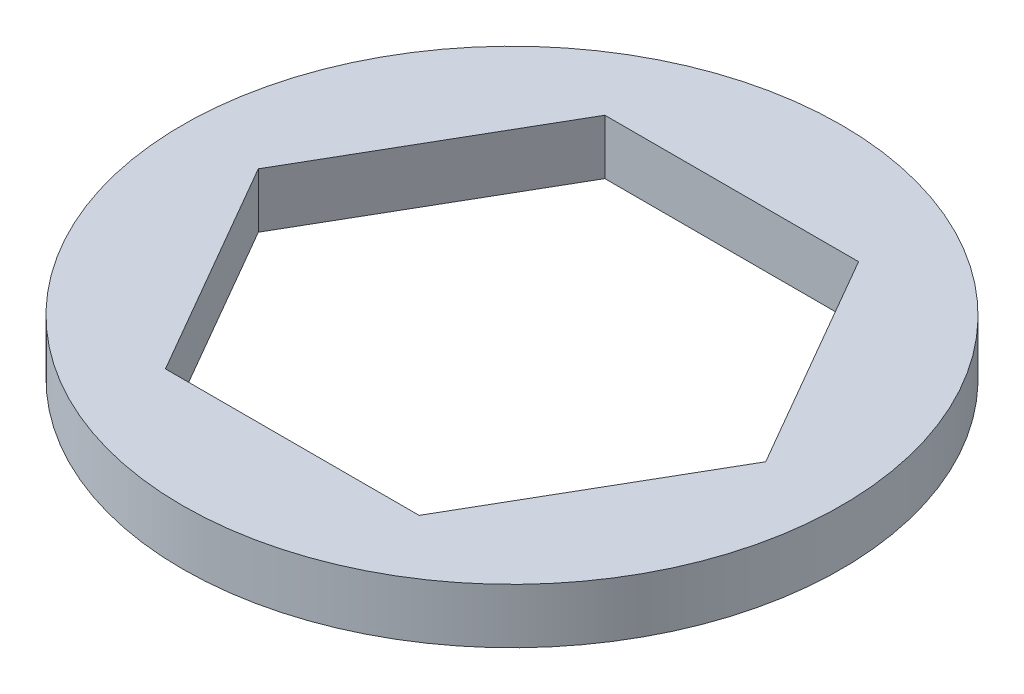
ISO-10303-21;
HEADER;
FILE_DESCRIPTION(('STEP AP214'),'2;1');
FILE_NAME('part.step','',(''),(''),'','','');
FILE_SCHEMA(('AUTOMOTIVE_DESIGN { 1 0 10303 214 1 1 1 1 }'));
ENDSEC;
DATA;
#1=APPLICATION_CONTEXT('core data for automotive mechanical design processes');
#2=APPLICATION_PROTOCOL_DEFINITION('international standard','automotive_design',2000,#1);
#3=PRODUCT_CONTEXT('',#1,'mechanical');
#4=PRODUCT('Part','Part','',(#3));
#5=PRODUCT_RELATED_PRODUCT_CATEGORY('part','',(#4));
#6=PRODUCT_DEFINITION_FORMATION('','',#4);
#7=PRODUCT_DEFINITION_CONTEXT('part definition',#1,'design');
#8=PRODUCT_DEFINITION('design','',#6,#7);
#9=PRODUCT_DEFINITION_SHAPE('','',#8);
#10=(LENGTH_UNIT() NAMED_UNIT(*) SI_UNIT(.MILLI.,.METRE.));
#11=(NAMED_UNIT(*) PLANE_ANGLE_UNIT() SI_UNIT($,.RADIAN.));
#12=(NAMED_UNIT(*) SI_UNIT($,.STERADIAN.) SOLID_ANGLE_UNIT());
#13=UNCERTAINTY_MEASURE_WITH_UNIT(LENGTH_MEASURE(1.E-05),#10,'distance_accuracy_value','');
#14=(GEOMETRIC_REPRESENTATION_CONTEXT(3) GLOBAL_UNCERTAINTY_ASSIGNED_CONTEXT((#13)) GLOBAL_UNIT_ASSIGNED_CONTEXT((#10,
#11,#12)) REPRESENTATION_CONTEXT('',''));
#15=CARTESIAN_POINT('',(0.,0.,0.));
#16=DIRECTION('',(0.,0.,1.));
#17=DIRECTION('',(1.,0.,0.));
#18=AXIS2_PLACEMENT_3D('',#15,#16,#17);
#19=CARTESIAN_POINT('',(0.,1.5875,0.));
#20=DIRECTION('',(0.,1.,0.));
#21=DIRECTION('',(0.,0.,1.));
#22=AXIS2_PLACEMENT_3D('',#19,#20,#21);
#23=PLANE('',#22);
#24=CARTESIAN_POINT('',(0.,1.5875,0.));
#25=DIRECTION('',(0.,1.,0.));
#26=DIRECTION('',(0.,0.,1.));
#27=AXIS2_PLACEMENT_3D('',#24,#25,#26);
#28=CIRCLE('',#27,9.525);
#29=CARTESIAN_POINT('',(0.,1.5875,9.525));
#30=VERTEX_POINT('',#29);
#31=EDGE_CURVE('E11',#30,#30,#28,.T.);
#32=ORIENTED_EDGE('',*,*,#31,.T.);
#33=EDGE_LOOP('',(#32));
#34=FACE_BOUND('',#33,.T.);
#35=DIRECTION('',(-0.5,0.,-0.866025403784439));
#36=VECTOR('',#35,1.);
#37=CARTESIAN_POINT('',(7.33234841870825,1.5875,0.));
#38=LINE('',#37,#36);
#39=CARTESIAN_POINT('',(7.33234841870825,1.5875,0.));
#40=VERTEX_POINT('',#39);
#41=CARTESIAN_POINT('',(3.66617420935412,1.5875,-6.35));
#42=VERTEX_POINT('',#41);
#43=EDGE_CURVE('E112',#40,#42,#38,.T.);
#44=ORIENTED_EDGE('',*,*,#43,.F.);
#45=DIRECTION('',(0.5,0.,-0.866025403784439));
#46=VECTOR('',#45,1.);
#47=CARTESIAN_POINT('',(3.66617420935413,1.5875,6.35));
#48=LINE('',#47,#46);
#49=CARTESIAN_POINT('',(3.66617420935413,1.5875,6.35));
#50=VERTEX_POINT('',#49);
#51=EDGE_CURVE('E103',#50,#40,#48,.T.);
#52=ORIENTED_EDGE('',*,*,#51,.F.);
#53=DIRECTION('',(1.,0.,0.));
#54=VECTOR('',#53,1.);
#55=CARTESIAN_POINT('',(-3.66617420935412,1.5875,6.35));
#56=LINE('',#55,#54);
#57=CARTESIAN_POINT('',(-3.66617420935412,1.5875,6.35));
#58=VERTEX_POINT('',#57);
#59=EDGE_CURVE('E137',#58,#50,#56,.T.);
#60=ORIENTED_EDGE('',*,*,#59,.F.);
#61=DIRECTION('',(0.5,0.,0.866025403784438));
#62=VECTOR('',#61,1.);
#63=CARTESIAN_POINT('',(-7.33234841870825,1.5875,0.));
#64=LINE('',#63,#62);
#65=CARTESIAN_POINT('',(-7.33234841870825,1.5875,0.));
#66=VERTEX_POINT('',#65);
#67=EDGE_CURVE('E134',#66,#58,#64,.T.);
#68=ORIENTED_EDGE('',*,*,#67,.F.);
#69=DIRECTION('',(-0.5,0.,0.866025403784439));
#70=VECTOR('',#69,1.);
#71=CARTESIAN_POINT('',(-3.66617420935412,1.5875,-6.35));
#72=LINE('',#71,#70);
#73=CARTESIAN_POINT('',(-3.66617420935412,1.5875,-6.35));
#74=VERTEX_POINT('',#73);
#75=EDGE_CURVE('E129',#74,#66,#72,.T.);
#76=ORIENTED_EDGE('',*,*,#75,.F.);
#77=DIRECTION('',(-1.,0.,0.));
#78=VECTOR('',#77,1.);
#79=CARTESIAN_POINT('',(3.66617420935412,1.5875,-6.35));
#80=LINE('',#79,#78);
#81=EDGE_CURVE('E125',#42,#74,#80,.T.);
#82=ORIENTED_EDGE('',*,*,#81,.F.);
#83=EDGE_LOOP('',(#44,#52,#60,#68,#76,#82));
#84=FACE_BOUND('',#83,.T.);
#85=ADVANCED_FACE('F49',(#34,#84),#23,.T.);
#86=CARTESIAN_POINT('',(0.,0.,0.));
#87=DIRECTION('',(0.,1.,0.));
#88=DIRECTION('',(0.,0.,1.));
#89=AXIS2_PLACEMENT_3D('',#86,#87,#88);
#90=PLANE('',#89);
#91=CARTESIAN_POINT('',(0.,0.,0.));
#92=DIRECTION('',(0.,1.,0.));
#93=DIRECTION('',(0.,0.,1.));
#94=AXIS2_PLACEMENT_3D('',#91,#92,#93);
#95=CIRCLE('',#94,9.525);
#96=CARTESIAN_POINT('',(0.,0.,9.525));
#97=VERTEX_POINT('',#96);
#98=EDGE_CURVE('E53',#97,#97,#95,.T.);
#99=ORIENTED_EDGE('',*,*,#98,.F.);
#100=EDGE_LOOP('',(#99));
#101=FACE_BOUND('',#100,.T.);
#102=DIRECTION('',(0.5,0.,-0.866025403784439));
#103=VECTOR('',#102,1.);
#104=CARTESIAN_POINT('',(3.66617420935413,0.,6.35));
#105=LINE('',#104,#103);
#106=CARTESIAN_POINT('',(3.66617420935413,0.,6.35));
#107=VERTEX_POINT('',#106);
#108=CARTESIAN_POINT('',(7.33234841870825,0.,0.));
#109=VERTEX_POINT('',#108);
#110=EDGE_CURVE('E73',#107,#109,#105,.T.);
#111=ORIENTED_EDGE('',*,*,#110,.T.);
#112=DIRECTION('',(-0.5,0.,-0.866025403784439));
#113=VECTOR('',#112,1.);
#114=CARTESIAN_POINT('',(7.33234841870825,0.,0.));
#115=LINE('',#114,#113);
#116=CARTESIAN_POINT('',(3.66617420935412,0.,-6.35));
#117=VERTEX_POINT('',#116);
#118=EDGE_CURVE('E119',#109,#117,#115,.T.);
#119=ORIENTED_EDGE('',*,*,#118,.T.);
#120=DIRECTION('',(-1.,0.,0.));
#121=VECTOR('',#120,1.);
#122=CARTESIAN_POINT('',(3.66617420935412,0.,-6.35));
#123=LINE('',#122,#121);
#124=CARTESIAN_POINT('',(-3.66617420935412,0.,-6.35));
#125=VERTEX_POINT('',#124);
#126=EDGE_CURVE('E144',#117,#125,#123,.T.);
#127=ORIENTED_EDGE('',*,*,#126,.T.);
#128=DIRECTION('',(-0.5,0.,0.866025403784439));
#129=VECTOR('',#128,1.);
#130=CARTESIAN_POINT('',(-3.66617420935412,0.,-6.35));
#131=LINE('',#130,#129);
#132=CARTESIAN_POINT('',(-7.33234841870825,0.,0.));
#133=VERTEX_POINT('',#132);
#134=EDGE_CURVE('E148',#125,#133,#131,.T.);
#135=ORIENTED_EDGE('',*,*,#134,.T.);
#136=DIRECTION('',(0.5,0.,0.866025403784438));
#137=VECTOR('',#136,1.);
#138=CARTESIAN_POINT('',(-7.33234841870825,0.,0.));
#139=LINE('',#138,#137);
#140=CARTESIAN_POINT('',(-3.66617420935412,0.,6.35));
#141=VERTEX_POINT('',#140);
#142=EDGE_CURVE('E152',#133,#141,#139,.T.);
#143=ORIENTED_EDGE('',*,*,#142,.T.);
#144=DIRECTION('',(1.,0.,0.));
#145=VECTOR('',#144,1.);
#146=CARTESIAN_POINT('',(-3.66617420935412,0.,6.35));
#147=LINE('',#146,#145);
#148=EDGE_CURVE('E113',#141,#107,#147,.T.);
#149=ORIENTED_EDGE('',*,*,#148,.T.);
#150=EDGE_LOOP('',(#111,#119,#127,#135,#143,#149));
#151=FACE_BOUND('',#150,.T.);
#152=ADVANCED_FACE('F176',(#101,#151),#90,.F.);
#153=CARTESIAN_POINT('',(0.,1.5875,0.));
#154=DIRECTION('',(0.,-1.,0.));
#155=DIRECTION('',(0.,0.,-1.));
#156=AXIS2_PLACEMENT_3D('',#153,#154,#155);
#157=CYLINDRICAL_SURFACE('',#156,9.525);
#158=ORIENTED_EDGE('',*,*,#31,.F.);
#159=EDGE_LOOP('',(#158));
#160=FACE_BOUND('',#159,.T.);
#161=ORIENTED_EDGE('',*,*,#98,.T.);
#162=EDGE_LOOP('',(#161));
#163=FACE_BOUND('',#162,.T.);
#164=ADVANCED_FACE('F51',(#160,#163),#157,.T.);
#165=CARTESIAN_POINT('',(3.66617420935413,1.5875,6.35));
#166=DIRECTION('',(-0.866025403784439,0.,-0.5));
#167=DIRECTION('',(-0.5,0.,0.866025403784439));
#168=AXIS2_PLACEMENT_3D('',#165,#166,#167);
#169=PLANE('',#168);
#170=ORIENTED_EDGE('',*,*,#110,.F.);
#171=DIRECTION('',(0.,-1.,0.));
#172=VECTOR('',#171,1.);
#173=CARTESIAN_POINT('',(3.66617420935413,1.5875,6.35));
#174=LINE('',#173,#172);
#175=EDGE_CURVE('E107',#50,#107,#174,.T.);
#176=ORIENTED_EDGE('',*,*,#175,.F.);
#177=ORIENTED_EDGE('',*,*,#51,.T.);
#178=DIRECTION('',(0.,-1.,0.));
#179=VECTOR('',#178,1.);
#180=CARTESIAN_POINT('',(7.33234841870825,1.5875,0.));
#181=LINE('',#180,#179);
#182=EDGE_CURVE('E106',#40,#109,#181,.T.);
#183=ORIENTED_EDGE('',*,*,#182,.T.);
#184=EDGE_LOOP('',(#170,#176,#177,#183));
#185=FACE_BOUND('',#184,.T.);
#186=ADVANCED_FACE('F105',(#185),#169,.T.);
#187=CARTESIAN_POINT('',(7.33234841870825,1.5875,0.));
#188=DIRECTION('',(-0.866025403784438,0.,0.5));
#189=DIRECTION('',(0.5,0.,0.866025403784439));
#190=AXIS2_PLACEMENT_3D('',#187,#188,#189);
#191=PLANE('',#190);
#192=ORIENTED_EDGE('',*,*,#118,.F.);
#193=ORIENTED_EDGE('',*,*,#182,.F.);
#194=ORIENTED_EDGE('',*,*,#43,.T.);
#195=DIRECTION('',(0.,-1.,0.));
#196=VECTOR('',#195,1.);
#197=CARTESIAN_POINT('',(3.66617420935412,1.5875,-6.35));
#198=LINE('',#197,#196);
#199=EDGE_CURVE('E121',#42,#117,#198,.T.);
#200=ORIENTED_EDGE('',*,*,#199,.T.);
#201=EDGE_LOOP('',(#192,#193,#194,#200));
#202=FACE_BOUND('',#201,.T.);
#203=ADVANCED_FACE('F116',(#202),#191,.T.);
#204=CARTESIAN_POINT('',(3.66617420935412,1.5875,-6.35));
#205=DIRECTION('',(0.,0.,1.));
#206=DIRECTION('',(1.,0.,0.));
#207=AXIS2_PLACEMENT_3D('',#204,#205,#206);
#208=PLANE('',#207);
#209=ORIENTED_EDGE('',*,*,#126,.F.);
#210=ORIENTED_EDGE('',*,*,#199,.F.);
#211=ORIENTED_EDGE('',*,*,#81,.T.);
#212=DIRECTION('',(0.,-1.,0.));
#213=VECTOR('',#212,1.);
#214=CARTESIAN_POINT('',(-3.66617420935412,1.5875,-6.35));
#215=LINE('',#214,#213);
#216=EDGE_CURVE('E166',#74,#125,#215,.T.);
#217=ORIENTED_EDGE('',*,*,#216,.T.);
#218=EDGE_LOOP('',(#209,#210,#211,#217));
#219=FACE_BOUND('',#218,.T.);
#220=ADVANCED_FACE('F172',(#219),#208,.T.);
#221=CARTESIAN_POINT('',(-3.66617420935412,1.5875,-6.35));
#222=DIRECTION('',(0.866025403784439,0.,0.5));
#223=DIRECTION('',(0.5,0.,-0.866025403784439));
#224=AXIS2_PLACEMENT_3D('',#221,#222,#223);
#225=PLANE('',#224);
#226=ORIENTED_EDGE('',*,*,#134,.F.);
#227=ORIENTED_EDGE('',*,*,#216,.F.);
#228=ORIENTED_EDGE('',*,*,#75,.T.);
#229=DIRECTION('',(0.,-1.,0.));
#230=VECTOR('',#229,1.);
#231=CARTESIAN_POINT('',(-7.33234841870825,1.5875,0.));
#232=LINE('',#231,#230);
#233=EDGE_CURVE('E163',#66,#133,#232,.T.);
#234=ORIENTED_EDGE('',*,*,#233,.T.);
#235=EDGE_LOOP('',(#226,#227,#228,#234));
#236=FACE_BOUND('',#235,.T.);
#237=ADVANCED_FACE('F184',(#236),#225,.T.);
#238=CARTESIAN_POINT('',(-7.33234841870825,1.5875,0.));
#239=DIRECTION('',(0.866025403784438,0.,-0.5));
#240=DIRECTION('',(-0.5,0.,-0.866025403784439));
#241=AXIS2_PLACEMENT_3D('',#238,#239,#240);
#242=PLANE('',#241);
#243=ORIENTED_EDGE('',*,*,#142,.F.);
#244=ORIENTED_EDGE('',*,*,#233,.F.);
#245=ORIENTED_EDGE('',*,*,#67,.T.);
#246=DIRECTION('',(0.,-1.,0.));
#247=VECTOR('',#246,1.);
#248=CARTESIAN_POINT('',(-3.66617420935412,1.5875,6.35));
#249=LINE('',#248,#247);
#250=EDGE_CURVE('E65',#58,#141,#249,.T.);
#251=ORIENTED_EDGE('',*,*,#250,.T.);
#252=EDGE_LOOP('',(#243,#244,#245,#251));
#253=FACE_BOUND('',#252,.T.);
#254=ADVANCED_FACE('F182',(#253),#242,.T.);
#255=CARTESIAN_POINT('',(-3.66617420935412,1.5875,6.35));
#256=DIRECTION('',(0.,0.,-1.));
#257=DIRECTION('',(-1.,0.,0.));
#258=AXIS2_PLACEMENT_3D('',#255,#256,#257);
#259=PLANE('',#258);
#260=ORIENTED_EDGE('',*,*,#148,.F.);
#261=ORIENTED_EDGE('',*,*,#250,.F.);
#262=ORIENTED_EDGE('',*,*,#59,.T.);
#263=ORIENTED_EDGE('',*,*,#175,.T.);
#264=EDGE_LOOP('',(#260,#261,#262,#263));
#265=FACE_BOUND('',#264,.T.);
#266=ADVANCED_FACE('F178',(#265),#259,.T.);
#267=CLOSED_SHELL('',(#85,#152,#164,#186,#203,#220,#237,#254,#266));
#268=MANIFOLD_SOLID_BREP('B2',#267);
#269=ADVANCED_BREP_SHAPE_REPRESENTATION('',(#18,#268),#14);
#270=SHAPE_DEFINITION_REPRESENTATION(#9,#269);
ENDSEC;
END-ISO-10303-21;
